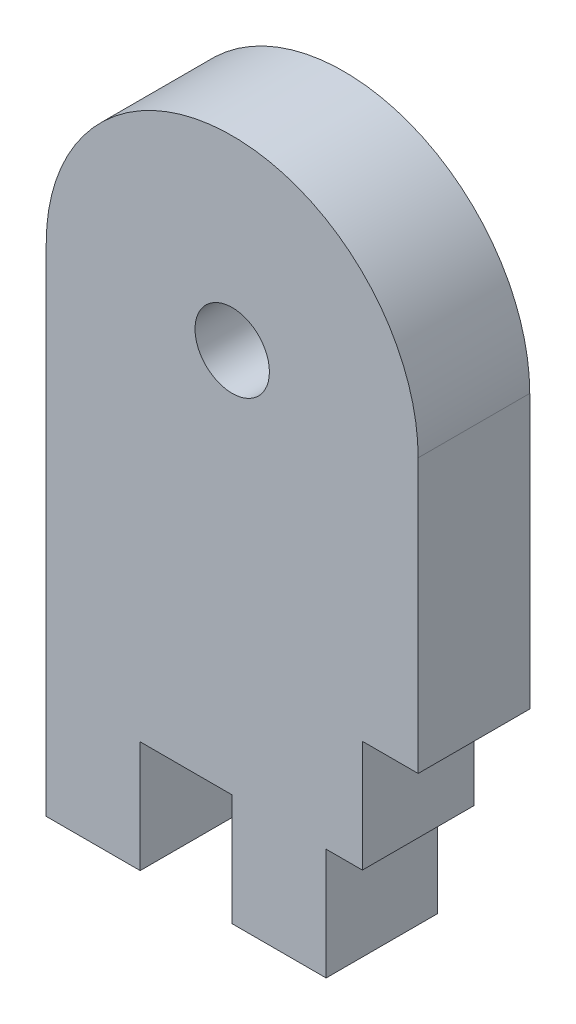
ISO-10303-21;
HEADER;
FILE_DESCRIPTION(('STEP AP214'),'2;1');
FILE_NAME('part.step','',(''),(''),'','','');
FILE_SCHEMA(('AUTOMOTIVE_DESIGN { 1 0 10303 214 1 1 1 1 }'));
ENDSEC;
DATA;
#1=APPLICATION_CONTEXT('core data for automotive mechanical design processes');
#2=APPLICATION_PROTOCOL_DEFINITION('international standard','automotive_design',2000,#1);
#3=PRODUCT_CONTEXT('',#1,'mechanical');
#4=PRODUCT('Part','Part','',(#3));
#5=PRODUCT_RELATED_PRODUCT_CATEGORY('part','',(#4));
#6=PRODUCT_DEFINITION_FORMATION('','',#4);
#7=PRODUCT_DEFINITION_CONTEXT('part definition',#1,'design');
#8=PRODUCT_DEFINITION('design','',#6,#7);
#9=PRODUCT_DEFINITION_SHAPE('','',#8);
#10=(LENGTH_UNIT() NAMED_UNIT(*) SI_UNIT(.MILLI.,.METRE.));
#11=(NAMED_UNIT(*) PLANE_ANGLE_UNIT() SI_UNIT($,.RADIAN.));
#12=(NAMED_UNIT(*) SI_UNIT($,.STERADIAN.) SOLID_ANGLE_UNIT());
#13=UNCERTAINTY_MEASURE_WITH_UNIT(LENGTH_MEASURE(1.E-05),#10,'distance_accuracy_value','');
#14=(GEOMETRIC_REPRESENTATION_CONTEXT(3) GLOBAL_UNCERTAINTY_ASSIGNED_CONTEXT((#13)) GLOBAL_UNIT_ASSIGNED_CONTEXT((#10,
#11,#12)) REPRESENTATION_CONTEXT('',''));
#15=CARTESIAN_POINT('',(0.,0.,0.));
#16=DIRECTION('',(0.,0.,1.));
#17=DIRECTION('',(1.,0.,0.));
#18=AXIS2_PLACEMENT_3D('',#15,#16,#17);
#19=CARTESIAN_POINT('',(10.,26.7,6.));
#20=DIRECTION('',(0.,0.,1.));
#21=DIRECTION('',(1.,0.,0.));
#22=AXIS2_PLACEMENT_3D('',#19,#20,#21);
#23=PLANE('',#22);
#24=DIRECTION('',(1.,0.,0.));
#25=VECTOR('',#24,1.);
#26=CARTESIAN_POINT('',(5.05,0.,6.));
#27=LINE('',#26,#25);
#28=CARTESIAN_POINT('',(0.,0.,6.));
#29=VERTEX_POINT('',#28);
#30=CARTESIAN_POINT('',(5.05,0.,6.));
#31=VERTEX_POINT('',#30);
#32=EDGE_CURVE('E204',#29,#31,#27,.T.);
#33=ORIENTED_EDGE('',*,*,#32,.T.);
#34=DIRECTION('',(0.,1.,0.));
#35=VECTOR('',#34,1.);
#36=CARTESIAN_POINT('',(5.05,6.,6.));
#37=LINE('',#36,#35);
#38=CARTESIAN_POINT('',(5.05,6.,6.));
#39=VERTEX_POINT('',#38);
#40=EDGE_CURVE('E116',#31,#39,#37,.T.);
#41=ORIENTED_EDGE('',*,*,#40,.T.);
#42=DIRECTION('',(1.,0.,0.));
#43=VECTOR('',#42,1.);
#44=CARTESIAN_POINT('',(10.,6.,6.));
#45=LINE('',#44,#43);
#46=CARTESIAN_POINT('',(10.,6.,6.));
#47=VERTEX_POINT('',#46);
#48=EDGE_CURVE('E241',#39,#47,#45,.T.);
#49=ORIENTED_EDGE('',*,*,#48,.T.);
#50=DIRECTION('',(0.,-1.,0.));
#51=VECTOR('',#50,1.);
#52=CARTESIAN_POINT('',(10.,0.,6.));
#53=LINE('',#52,#51);
#54=CARTESIAN_POINT('',(10.,0.,6.));
#55=VERTEX_POINT('',#54);
#56=EDGE_CURVE('E261',#47,#55,#53,.T.);
#57=ORIENTED_EDGE('',*,*,#56,.T.);
#58=DIRECTION('',(1.,0.,0.));
#59=VECTOR('',#58,1.);
#60=CARTESIAN_POINT('',(15.05,0.,6.));
#61=LINE('',#60,#59);
#62=CARTESIAN_POINT('',(15.05,0.,6.));
#63=VERTEX_POINT('',#62);
#64=EDGE_CURVE('E257',#55,#63,#61,.T.);
#65=ORIENTED_EDGE('',*,*,#64,.T.);
#66=DIRECTION('',(0.,1.,0.));
#67=VECTOR('',#66,1.);
#68=CARTESIAN_POINT('',(15.05,6.,6.));
#69=LINE('',#68,#67);
#70=CARTESIAN_POINT('',(15.05,6.,6.));
#71=VERTEX_POINT('',#70);
#72=EDGE_CURVE('E260',#63,#71,#69,.T.);
#73=ORIENTED_EDGE('',*,*,#72,.T.);
#74=DIRECTION('',(1.,0.,0.));
#75=VECTOR('',#74,1.);
#76=CARTESIAN_POINT('',(17.,6.,6.));
#77=LINE('',#76,#75);
#78=CARTESIAN_POINT('',(17.,6.,6.));
#79=VERTEX_POINT('',#78);
#80=EDGE_CURVE('E265',#71,#79,#77,.T.);
#81=ORIENTED_EDGE('',*,*,#80,.T.);
#82=DIRECTION('',(0.,1.,0.));
#83=VECTOR('',#82,1.);
#84=CARTESIAN_POINT('',(17.,12.,6.));
#85=LINE('',#84,#83);
#86=CARTESIAN_POINT('',(17.,12.,6.));
#87=VERTEX_POINT('',#86);
#88=EDGE_CURVE('E272',#79,#87,#85,.T.);
#89=ORIENTED_EDGE('',*,*,#88,.T.);
#90=DIRECTION('',(1.,0.,0.));
#91=VECTOR('',#90,1.);
#92=CARTESIAN_POINT('',(20.,12.,6.));
#93=LINE('',#92,#91);
#94=CARTESIAN_POINT('',(20.,12.,6.));
#95=VERTEX_POINT('',#94);
#96=EDGE_CURVE('E147',#87,#95,#93,.T.);
#97=ORIENTED_EDGE('',*,*,#96,.T.);
#98=DIRECTION('',(0.,1.,0.));
#99=VECTOR('',#98,1.);
#100=CARTESIAN_POINT('',(20.,26.7,6.));
#101=LINE('',#100,#99);
#102=CARTESIAN_POINT('',(20.,26.7,6.));
#103=VERTEX_POINT('',#102);
#104=EDGE_CURVE('E141',#95,#103,#101,.T.);
#105=ORIENTED_EDGE('',*,*,#104,.T.);
#106=CARTESIAN_POINT('',(10.,26.7,6.));
#107=DIRECTION('',(0.,0.,1.));
#108=DIRECTION('',(1.,0.,0.));
#109=AXIS2_PLACEMENT_3D('',#106,#107,#108);
#110=CIRCLE('',#109,10.);
#111=CARTESIAN_POINT('',(0.,26.7,6.));
#112=VERTEX_POINT('',#111);
#113=EDGE_CURVE('E145',#103,#112,#110,.T.);
#114=ORIENTED_EDGE('',*,*,#113,.T.);
#115=DIRECTION('',(0.,-1.,0.));
#116=VECTOR('',#115,1.);
#117=CARTESIAN_POINT('',(0.,0.,6.));
#118=LINE('',#117,#116);
#119=EDGE_CURVE('E61',#112,#29,#118,.T.);
#120=ORIENTED_EDGE('',*,*,#119,.T.);
#121=EDGE_LOOP('',(#33,#41,#49,#57,#65,#73,#81,#89,#97,#105,#114,#120));
#122=FACE_BOUND('',#121,.T.);
#123=CARTESIAN_POINT('',(10.,26.7,6.));
#124=DIRECTION('',(0.,0.,1.));
#125=DIRECTION('',(1.,0.,0.));
#126=AXIS2_PLACEMENT_3D('',#123,#124,#125);
#127=CIRCLE('',#126,2.);
#128=CARTESIAN_POINT('',(12.,26.7,6.));
#129=VERTEX_POINT('',#128);
#130=EDGE_CURVE('E174',#129,#129,#127,.T.);
#131=ORIENTED_EDGE('',*,*,#130,.F.);
#132=EDGE_LOOP('',(#131));
#133=FACE_BOUND('',#132,.T.);
#134=ADVANCED_FACE('F43',(#122,#133),#23,.T.);
#135=CARTESIAN_POINT('',(10.,26.7,0.));
#136=DIRECTION('',(0.,0.,1.));
#137=DIRECTION('',(1.,0.,0.));
#138=AXIS2_PLACEMENT_3D('',#135,#136,#137);
#139=PLANE('',#138);
#140=DIRECTION('',(1.,0.,0.));
#141=VECTOR('',#140,1.);
#142=CARTESIAN_POINT('',(5.05,0.,0.));
#143=LINE('',#142,#141);
#144=CARTESIAN_POINT('',(0.,0.,0.));
#145=VERTEX_POINT('',#144);
#146=CARTESIAN_POINT('',(5.05,0.,0.));
#147=VERTEX_POINT('',#146);
#148=EDGE_CURVE('E169',#145,#147,#143,.T.);
#149=ORIENTED_EDGE('',*,*,#148,.F.);
#150=DIRECTION('',(0.,-1.,0.));
#151=VECTOR('',#150,1.);
#152=CARTESIAN_POINT('',(0.,0.,0.));
#153=LINE('',#152,#151);
#154=CARTESIAN_POINT('',(0.,26.7,0.));
#155=VERTEX_POINT('',#154);
#156=EDGE_CURVE('E108',#155,#145,#153,.T.);
#157=ORIENTED_EDGE('',*,*,#156,.F.);
#158=CARTESIAN_POINT('',(10.,26.7,0.));
#159=DIRECTION('',(0.,0.,1.));
#160=DIRECTION('',(1.,0.,0.));
#161=AXIS2_PLACEMENT_3D('',#158,#159,#160);
#162=CIRCLE('',#161,10.);
#163=CARTESIAN_POINT('',(20.,26.7,0.));
#164=VERTEX_POINT('',#163);
#165=EDGE_CURVE('E102',#164,#155,#162,.T.);
#166=ORIENTED_EDGE('',*,*,#165,.F.);
#167=DIRECTION('',(0.,1.,0.));
#168=VECTOR('',#167,1.);
#169=CARTESIAN_POINT('',(20.,26.7,0.));
#170=LINE('',#169,#168);
#171=CARTESIAN_POINT('',(20.,12.,0.));
#172=VERTEX_POINT('',#171);
#173=EDGE_CURVE('E156',#172,#164,#170,.T.);
#174=ORIENTED_EDGE('',*,*,#173,.F.);
#175=DIRECTION('',(1.,0.,0.));
#176=VECTOR('',#175,1.);
#177=CARTESIAN_POINT('',(20.,12.,0.));
#178=LINE('',#177,#176);
#179=CARTESIAN_POINT('',(17.,12.,0.));
#180=VERTEX_POINT('',#179);
#181=EDGE_CURVE('E195',#180,#172,#178,.T.);
#182=ORIENTED_EDGE('',*,*,#181,.F.);
#183=DIRECTION('',(0.,1.,0.));
#184=VECTOR('',#183,1.);
#185=CARTESIAN_POINT('',(17.,12.,0.));
#186=LINE('',#185,#184);
#187=CARTESIAN_POINT('',(17.,6.,0.));
#188=VERTEX_POINT('',#187);
#189=EDGE_CURVE('E192',#188,#180,#186,.T.);
#190=ORIENTED_EDGE('',*,*,#189,.F.);
#191=DIRECTION('',(1.,0.,0.));
#192=VECTOR('',#191,1.);
#193=CARTESIAN_POINT('',(17.,6.,0.));
#194=LINE('',#193,#192);
#195=CARTESIAN_POINT('',(15.05,6.,0.));
#196=VERTEX_POINT('',#195);
#197=EDGE_CURVE('E189',#196,#188,#194,.T.);
#198=ORIENTED_EDGE('',*,*,#197,.F.);
#199=DIRECTION('',(0.,1.,0.));
#200=VECTOR('',#199,1.);
#201=CARTESIAN_POINT('',(15.05,6.,0.));
#202=LINE('',#201,#200);
#203=CARTESIAN_POINT('',(15.05,0.,0.));
#204=VERTEX_POINT('',#203);
#205=EDGE_CURVE('E186',#204,#196,#202,.T.);
#206=ORIENTED_EDGE('',*,*,#205,.F.);
#207=DIRECTION('',(1.,0.,0.));
#208=VECTOR('',#207,1.);
#209=CARTESIAN_POINT('',(15.05,0.,0.));
#210=LINE('',#209,#208);
#211=CARTESIAN_POINT('',(10.,0.,0.));
#212=VERTEX_POINT('',#211);
#213=EDGE_CURVE('E183',#212,#204,#210,.T.);
#214=ORIENTED_EDGE('',*,*,#213,.F.);
#215=DIRECTION('',(0.,-1.,0.));
#216=VECTOR('',#215,1.);
#217=CARTESIAN_POINT('',(10.,0.,0.));
#218=LINE('',#217,#216);
#219=CARTESIAN_POINT('',(10.,6.,0.));
#220=VERTEX_POINT('',#219);
#221=EDGE_CURVE('E180',#220,#212,#218,.T.);
#222=ORIENTED_EDGE('',*,*,#221,.F.);
#223=DIRECTION('',(1.,0.,0.));
#224=VECTOR('',#223,1.);
#225=CARTESIAN_POINT('',(10.,6.,0.));
#226=LINE('',#225,#224);
#227=CARTESIAN_POINT('',(5.05,6.,0.));
#228=VERTEX_POINT('',#227);
#229=EDGE_CURVE('E177',#228,#220,#226,.T.);
#230=ORIENTED_EDGE('',*,*,#229,.F.);
#231=DIRECTION('',(0.,1.,0.));
#232=VECTOR('',#231,1.);
#233=CARTESIAN_POINT('',(5.05,6.,0.));
#234=LINE('',#233,#232);
#235=EDGE_CURVE('E173',#147,#228,#234,.T.);
#236=ORIENTED_EDGE('',*,*,#235,.F.);
#237=EDGE_LOOP('',(#149,#157,#166,#174,#182,#190,#198,#206,#214,#222,#230,#236));
#238=FACE_BOUND('',#237,.T.);
#239=CARTESIAN_POINT('',(10.,26.7,0.));
#240=DIRECTION('',(0.,0.,1.));
#241=DIRECTION('',(1.,0.,0.));
#242=AXIS2_PLACEMENT_3D('',#239,#240,#241);
#243=CIRCLE('',#242,2.);
#244=CARTESIAN_POINT('',(12.,26.7,0.));
#245=VERTEX_POINT('',#244);
#246=EDGE_CURVE('E451',#245,#245,#243,.T.);
#247=ORIENTED_EDGE('',*,*,#246,.T.);
#248=EDGE_LOOP('',(#247));
#249=FACE_BOUND('',#248,.T.);
#250=ADVANCED_FACE('F245',(#238,#249),#139,.F.);
#251=CARTESIAN_POINT('',(5.05,0.,6.));
#252=DIRECTION('',(0.,1.,0.));
#253=DIRECTION('',(0.,0.,1.));
#254=AXIS2_PLACEMENT_3D('',#251,#252,#253);
#255=PLANE('',#254);
#256=ORIENTED_EDGE('',*,*,#148,.T.);
#257=DIRECTION('',(0.,0.,-1.));
#258=VECTOR('',#257,1.);
#259=CARTESIAN_POINT('',(5.05,0.,6.));
#260=LINE('',#259,#258);
#261=EDGE_CURVE('E11',#31,#147,#260,.T.);
#262=ORIENTED_EDGE('',*,*,#261,.F.);
#263=ORIENTED_EDGE('',*,*,#32,.F.);
#264=DIRECTION('',(0.,0.,-1.));
#265=VECTOR('',#264,1.);
#266=CARTESIAN_POINT('',(0.,0.,6.));
#267=LINE('',#266,#265);
#268=EDGE_CURVE('E165',#29,#145,#267,.T.);
#269=ORIENTED_EDGE('',*,*,#268,.T.);
#270=EDGE_LOOP('',(#256,#262,#263,#269));
#271=FACE_BOUND('',#270,.T.);
#272=ADVANCED_FACE('F45',(#271),#255,.F.);
#273=CARTESIAN_POINT('',(5.05,6.,6.));
#274=DIRECTION('',(-1.,0.,0.));
#275=DIRECTION('',(0.,-1.,0.));
#276=AXIS2_PLACEMENT_3D('',#273,#274,#275);
#277=PLANE('',#276);
#278=ORIENTED_EDGE('',*,*,#235,.T.);
#279=DIRECTION('',(0.,0.,-1.));
#280=VECTOR('',#279,1.);
#281=CARTESIAN_POINT('',(5.05,6.,6.));
#282=LINE('',#281,#280);
#283=EDGE_CURVE('E53',#39,#228,#282,.T.);
#284=ORIENTED_EDGE('',*,*,#283,.F.);
#285=ORIENTED_EDGE('',*,*,#40,.F.);
#286=ORIENTED_EDGE('',*,*,#261,.T.);
#287=EDGE_LOOP('',(#278,#284,#285,#286));
#288=FACE_BOUND('',#287,.T.);
#289=ADVANCED_FACE('F308',(#288),#277,.F.);
#290=CARTESIAN_POINT('',(10.,6.,6.));
#291=DIRECTION('',(0.,1.,0.));
#292=DIRECTION('',(0.,0.,1.));
#293=AXIS2_PLACEMENT_3D('',#290,#291,#292);
#294=PLANE('',#293);
#295=ORIENTED_EDGE('',*,*,#229,.T.);
#296=DIRECTION('',(0.,0.,-1.));
#297=VECTOR('',#296,1.);
#298=CARTESIAN_POINT('',(10.,6.,6.));
#299=LINE('',#298,#297);
#300=EDGE_CURVE('E231',#47,#220,#299,.T.);
#301=ORIENTED_EDGE('',*,*,#300,.F.);
#302=ORIENTED_EDGE('',*,*,#48,.F.);
#303=ORIENTED_EDGE('',*,*,#283,.T.);
#304=EDGE_LOOP('',(#295,#301,#302,#303));
#305=FACE_BOUND('',#304,.T.);
#306=ADVANCED_FACE('F239',(#305),#294,.F.);
#307=CARTESIAN_POINT('',(10.,0.,6.));
#308=DIRECTION('',(1.,0.,0.));
#309=DIRECTION('',(0.,0.,-1.));
#310=AXIS2_PLACEMENT_3D('',#307,#308,#309);
#311=PLANE('',#310);
#312=ORIENTED_EDGE('',*,*,#221,.T.);
#313=DIRECTION('',(0.,0.,-1.));
#314=VECTOR('',#313,1.);
#315=CARTESIAN_POINT('',(10.,0.,6.));
#316=LINE('',#315,#314);
#317=EDGE_CURVE('E227',#55,#212,#316,.T.);
#318=ORIENTED_EDGE('',*,*,#317,.F.);
#319=ORIENTED_EDGE('',*,*,#56,.F.);
#320=ORIENTED_EDGE('',*,*,#300,.T.);
#321=EDGE_LOOP('',(#312,#318,#319,#320));
#322=FACE_BOUND('',#321,.T.);
#323=ADVANCED_FACE('F251',(#322),#311,.F.);
#324=CARTESIAN_POINT('',(15.05,0.,6.));
#325=DIRECTION('',(0.,1.,0.));
#326=DIRECTION('',(-1.,0.,0.));
#327=AXIS2_PLACEMENT_3D('',#324,#325,#326);
#328=PLANE('',#327);
#329=ORIENTED_EDGE('',*,*,#213,.T.);
#330=DIRECTION('',(0.,0.,-1.));
#331=VECTOR('',#330,1.);
#332=CARTESIAN_POINT('',(15.05,0.,6.));
#333=LINE('',#332,#331);
#334=EDGE_CURVE('E223',#63,#204,#333,.T.);
#335=ORIENTED_EDGE('',*,*,#334,.F.);
#336=ORIENTED_EDGE('',*,*,#64,.F.);
#337=ORIENTED_EDGE('',*,*,#317,.T.);
#338=EDGE_LOOP('',(#329,#335,#336,#337));
#339=FACE_BOUND('',#338,.T.);
#340=ADVANCED_FACE('F255',(#339),#328,.F.);
#341=CARTESIAN_POINT('',(15.05,6.,6.));
#342=DIRECTION('',(-1.,0.,0.));
#343=DIRECTION('',(0.,0.,1.));
#344=AXIS2_PLACEMENT_3D('',#341,#342,#343);
#345=PLANE('',#344);
#346=ORIENTED_EDGE('',*,*,#205,.T.);
#347=DIRECTION('',(0.,0.,-1.));
#348=VECTOR('',#347,1.);
#349=CARTESIAN_POINT('',(15.05,6.,6.));
#350=LINE('',#349,#348);
#351=EDGE_CURVE('E219',#71,#196,#350,.T.);
#352=ORIENTED_EDGE('',*,*,#351,.F.);
#353=ORIENTED_EDGE('',*,*,#72,.F.);
#354=ORIENTED_EDGE('',*,*,#334,.T.);
#355=EDGE_LOOP('',(#346,#352,#353,#354));
#356=FACE_BOUND('',#355,.T.);
#357=ADVANCED_FACE('F321',(#356),#345,.F.);
#358=CARTESIAN_POINT('',(17.,6.,6.));
#359=DIRECTION('',(0.,1.,0.));
#360=DIRECTION('',(-1.,0.,0.));
#361=AXIS2_PLACEMENT_3D('',#358,#359,#360);
#362=PLANE('',#361);
#363=ORIENTED_EDGE('',*,*,#197,.T.);
#364=DIRECTION('',(0.,0.,-1.));
#365=VECTOR('',#364,1.);
#366=CARTESIAN_POINT('',(17.,6.,6.));
#367=LINE('',#366,#365);
#368=EDGE_CURVE('E215',#79,#188,#367,.T.);
#369=ORIENTED_EDGE('',*,*,#368,.F.);
#370=ORIENTED_EDGE('',*,*,#80,.F.);
#371=ORIENTED_EDGE('',*,*,#351,.T.);
#372=EDGE_LOOP('',(#363,#369,#370,#371));
#373=FACE_BOUND('',#372,.T.);
#374=ADVANCED_FACE('F324',(#373),#362,.F.);
#375=CARTESIAN_POINT('',(17.,12.,6.));
#376=DIRECTION('',(-1.,0.,0.));
#377=DIRECTION('',(0.,-1.,0.));
#378=AXIS2_PLACEMENT_3D('',#375,#376,#377);
#379=PLANE('',#378);
#380=ORIENTED_EDGE('',*,*,#189,.T.);
#381=DIRECTION('',(0.,0.,-1.));
#382=VECTOR('',#381,1.);
#383=CARTESIAN_POINT('',(17.,12.,6.));
#384=LINE('',#383,#382);
#385=EDGE_CURVE('E211',#87,#180,#384,.T.);
#386=ORIENTED_EDGE('',*,*,#385,.F.);
#387=ORIENTED_EDGE('',*,*,#88,.F.);
#388=ORIENTED_EDGE('',*,*,#368,.T.);
#389=EDGE_LOOP('',(#380,#386,#387,#388));
#390=FACE_BOUND('',#389,.T.);
#391=ADVANCED_FACE('F280',(#390),#379,.F.);
#392=CARTESIAN_POINT('',(20.,12.,6.));
#393=DIRECTION('',(0.,1.,0.));
#394=DIRECTION('',(0.,0.,1.));
#395=AXIS2_PLACEMENT_3D('',#392,#393,#394);
#396=PLANE('',#395);
#397=ORIENTED_EDGE('',*,*,#181,.T.);
#398=DIRECTION('',(0.,0.,-1.));
#399=VECTOR('',#398,1.);
#400=CARTESIAN_POINT('',(20.,12.,6.));
#401=LINE('',#400,#399);
#402=EDGE_CURVE('E158',#95,#172,#401,.T.);
#403=ORIENTED_EDGE('',*,*,#402,.F.);
#404=ORIENTED_EDGE('',*,*,#96,.F.);
#405=ORIENTED_EDGE('',*,*,#385,.T.);
#406=EDGE_LOOP('',(#397,#403,#404,#405));
#407=FACE_BOUND('',#406,.T.);
#408=ADVANCED_FACE('F284',(#407),#396,.F.);
#409=CARTESIAN_POINT('',(20.,26.7,6.));
#410=DIRECTION('',(-1.,0.,0.));
#411=DIRECTION('',(0.,0.,1.));
#412=AXIS2_PLACEMENT_3D('',#409,#410,#411);
#413=PLANE('',#412);
#414=ORIENTED_EDGE('',*,*,#173,.T.);
#415=DIRECTION('',(0.,0.,-1.));
#416=VECTOR('',#415,1.);
#417=CARTESIAN_POINT('',(20.,26.7,6.));
#418=LINE('',#417,#416);
#419=EDGE_CURVE('E153',#103,#164,#418,.T.);
#420=ORIENTED_EDGE('',*,*,#419,.F.);
#421=ORIENTED_EDGE('',*,*,#104,.F.);
#422=ORIENTED_EDGE('',*,*,#402,.T.);
#423=EDGE_LOOP('',(#414,#420,#421,#422));
#424=FACE_BOUND('',#423,.T.);
#425=ADVANCED_FACE('F154',(#424),#413,.F.);
#426=CARTESIAN_POINT('',(10.,26.7,6.));
#427=DIRECTION('',(0.,0.,-1.));
#428=DIRECTION('',(-1.,0.,0.));
#429=AXIS2_PLACEMENT_3D('',#426,#427,#428);
#430=CYLINDRICAL_SURFACE('',#429,10.);
#431=ORIENTED_EDGE('',*,*,#165,.T.);
#432=DIRECTION('',(0.,0.,-1.));
#433=VECTOR('',#432,1.);
#434=CARTESIAN_POINT('',(0.,26.7,6.));
#435=LINE('',#434,#433);
#436=EDGE_CURVE('E159',#112,#155,#435,.T.);
#437=ORIENTED_EDGE('',*,*,#436,.F.);
#438=ORIENTED_EDGE('',*,*,#113,.F.);
#439=ORIENTED_EDGE('',*,*,#419,.T.);
#440=EDGE_LOOP('',(#431,#437,#438,#439));
#441=FACE_BOUND('',#440,.T.);
#442=ADVANCED_FACE('F161',(#441),#430,.T.);
#443=CARTESIAN_POINT('',(0.,0.,6.));
#444=DIRECTION('',(1.,0.,0.));
#445=DIRECTION('',(0.,0.,-1.));
#446=AXIS2_PLACEMENT_3D('',#443,#444,#445);
#447=PLANE('',#446);
#448=ORIENTED_EDGE('',*,*,#156,.T.);
#449=ORIENTED_EDGE('',*,*,#268,.F.);
#450=ORIENTED_EDGE('',*,*,#119,.F.);
#451=ORIENTED_EDGE('',*,*,#436,.T.);
#452=EDGE_LOOP('',(#448,#449,#450,#451));
#453=FACE_BOUND('',#452,.T.);
#454=ADVANCED_FACE('F288',(#453),#447,.F.);
#455=CARTESIAN_POINT('',(10.,26.7,6.));
#456=DIRECTION('',(0.,0.,-1.));
#457=DIRECTION('',(-1.,0.,0.));
#458=AXIS2_PLACEMENT_3D('',#455,#456,#457);
#459=CYLINDRICAL_SURFACE('',#458,2.);
#460=ORIENTED_EDGE('',*,*,#130,.T.);
#461=EDGE_LOOP('',(#460));
#462=FACE_BOUND('',#461,.T.);
#463=ORIENTED_EDGE('',*,*,#246,.F.);
#464=EDGE_LOOP('',(#463));
#465=FACE_BOUND('',#464,.T.);
#466=ADVANCED_FACE('F290',(#462,#465),#459,.F.);
#467=CLOSED_SHELL('',(#134,#250,#272,#289,#306,#323,#340,#357,#374,#391,#408,#425,#442,#454,#466));
#468=MANIFOLD_SOLID_BREP('B2',#467);
#469=ADVANCED_BREP_SHAPE_REPRESENTATION('',(#18,#468),#14);
#470=SHAPE_DEFINITION_REPRESENTATION(#9,#469);
ENDSEC;
END-ISO-10303-21;
